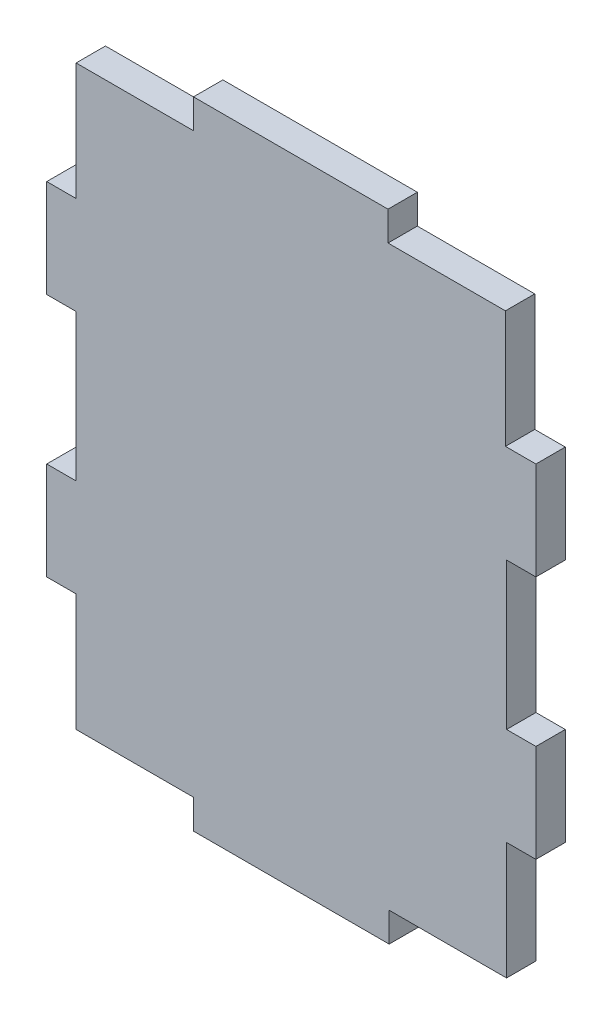
ISO-10303-21;
HEADER;
FILE_DESCRIPTION(('STEP AP214'),'2;1');
FILE_NAME('part.step','',(''),(''),'','','');
FILE_SCHEMA(('AUTOMOTIVE_DESIGN { 1 0 10303 214 1 1 1 1 }'));
ENDSEC;
DATA;
#1=APPLICATION_CONTEXT('core data for automotive mechanical design processes');
#2=APPLICATION_PROTOCOL_DEFINITION('international standard','automotive_design',2000,#1);
#3=PRODUCT_CONTEXT('',#1,'mechanical');
#4=PRODUCT('Part','Part','',(#3));
#5=PRODUCT_RELATED_PRODUCT_CATEGORY('part','',(#4));
#6=PRODUCT_DEFINITION_FORMATION('','',#4);
#7=PRODUCT_DEFINITION_CONTEXT('part definition',#1,'design');
#8=PRODUCT_DEFINITION('design','',#6,#7);
#9=PRODUCT_DEFINITION_SHAPE('','',#8);
#10=(LENGTH_UNIT() NAMED_UNIT(*) SI_UNIT(.MILLI.,.METRE.));
#11=(NAMED_UNIT(*) PLANE_ANGLE_UNIT() SI_UNIT($,.RADIAN.));
#12=(NAMED_UNIT(*) SI_UNIT($,.STERADIAN.) SOLID_ANGLE_UNIT());
#13=UNCERTAINTY_MEASURE_WITH_UNIT(LENGTH_MEASURE(1.E-05),#10,'distance_accuracy_value','');
#14=(GEOMETRIC_REPRESENTATION_CONTEXT(3) GLOBAL_UNCERTAINTY_ASSIGNED_CONTEXT((#13)) GLOBAL_UNIT_ASSIGNED_CONTEXT((#10,
#11,#12)) REPRESENTATION_CONTEXT('',''));
#15=CARTESIAN_POINT('',(0.,0.,0.));
#16=DIRECTION('',(0.,0.,1.));
#17=DIRECTION('',(1.,0.,0.));
#18=AXIS2_PLACEMENT_3D('',#15,#16,#17);
#19=CARTESIAN_POINT('',(0.,0.,6.));
#20=DIRECTION('',(-1.,0.,0.));
#21=DIRECTION('',(0.,-1.,0.));
#22=AXIS2_PLACEMENT_3D('',#19,#20,#21);
#23=PLANE('',#22);
#24=DIRECTION('',(0.,1.,0.));
#25=VECTOR('',#24,1.);
#26=CARTESIAN_POINT('',(0.,0.,0.));
#27=LINE('',#26,#25);
#28=CARTESIAN_POINT('',(0.,30.,0.));
#29=VERTEX_POINT('',#28);
#30=CARTESIAN_POINT('',(0.,50.,0.));
#31=VERTEX_POINT('',#30);
#32=EDGE_CURVE('E243',#29,#31,#27,.T.);
#33=ORIENTED_EDGE('',*,*,#32,.T.);
#34=DIRECTION('',(0.,0.,1.));
#35=VECTOR('',#34,1.);
#36=CARTESIAN_POINT('',(0.,50.,0.));
#37=LINE('',#36,#35);
#38=CARTESIAN_POINT('',(0.,50.,6.));
#39=VERTEX_POINT('',#38);
#40=EDGE_CURVE('E391',#31,#39,#37,.T.);
#41=ORIENTED_EDGE('',*,*,#40,.T.);
#42=DIRECTION('',(0.,1.,0.));
#43=VECTOR('',#42,1.);
#44=CARTESIAN_POINT('',(0.,0.,6.));
#45=LINE('',#44,#43);
#46=CARTESIAN_POINT('',(0.,30.,6.));
#47=VERTEX_POINT('',#46);
#48=EDGE_CURVE('E371',#47,#39,#45,.T.);
#49=ORIENTED_EDGE('',*,*,#48,.F.);
#50=DIRECTION('',(0.,0.,1.));
#51=VECTOR('',#50,1.);
#52=CARTESIAN_POINT('',(0.,30.,0.));
#53=LINE('',#52,#51);
#54=EDGE_CURVE('E425',#29,#47,#53,.T.);
#55=ORIENTED_EDGE('',*,*,#54,.F.);
#56=EDGE_LOOP('',(#33,#41,#49,#55));
#57=FACE_BOUND('',#56,.T.);
#58=ADVANCED_FACE('F33',(#57),#23,.F.);
#59=CARTESIAN_POINT('',(-100.,0.,6.));
#60=DIRECTION('',(1.,0.,0.));
#61=DIRECTION('',(0.,0.,-1.));
#62=AXIS2_PLACEMENT_3D('',#59,#60,#61);
#63=PLANE('',#62);
#64=DIRECTION('',(0.,-1.,0.));
#65=VECTOR('',#64,1.);
#66=CARTESIAN_POINT('',(-100.,0.,0.));
#67=LINE('',#66,#65);
#68=CARTESIAN_POINT('',(-100.,100.,0.));
#69=VERTEX_POINT('',#68);
#70=CARTESIAN_POINT('',(-100.,80.,0.));
#71=VERTEX_POINT('',#70);
#72=EDGE_CURVE('E254',#69,#71,#67,.T.);
#73=ORIENTED_EDGE('',*,*,#72,.T.);
#74=DIRECTION('',(0.,0.,1.));
#75=VECTOR('',#74,1.);
#76=CARTESIAN_POINT('',(-100.,80.,0.));
#77=LINE('',#76,#75);
#78=CARTESIAN_POINT('',(-100.,80.,6.));
#79=VERTEX_POINT('',#78);
#80=EDGE_CURVE('E404',#71,#79,#77,.T.);
#81=ORIENTED_EDGE('',*,*,#80,.T.);
#82=DIRECTION('',(0.,-1.,0.));
#83=VECTOR('',#82,1.);
#84=CARTESIAN_POINT('',(-100.,0.,6.));
#85=LINE('',#84,#83);
#86=CARTESIAN_POINT('',(-100.,100.,6.));
#87=VERTEX_POINT('',#86);
#88=EDGE_CURVE('E42',#87,#79,#85,.T.);
#89=ORIENTED_EDGE('',*,*,#88,.F.);
#90=DIRECTION('',(0.,0.,1.));
#91=VECTOR('',#90,1.);
#92=CARTESIAN_POINT('',(-100.,100.,0.));
#93=LINE('',#92,#91);
#94=EDGE_CURVE('E354',#69,#87,#93,.T.);
#95=ORIENTED_EDGE('',*,*,#94,.F.);
#96=EDGE_LOOP('',(#73,#81,#89,#95));
#97=FACE_BOUND('',#96,.T.);
#98=ADVANCED_FACE('F467',(#97),#63,.F.);
#99=CARTESIAN_POINT('',(0.,80.,6.));
#100=VERTEX_POINT('',#99);
#101=CARTESIAN_POINT('',(0.,100.,6.));
#102=VERTEX_POINT('',#101);
#103=EDGE_CURVE('E235',#100,#102,#45,.T.);
#104=ORIENTED_EDGE('',*,*,#103,.F.);
#105=DIRECTION('',(0.,0.,1.));
#106=VECTOR('',#105,1.);
#107=CARTESIAN_POINT('',(0.,80.,0.));
#108=LINE('',#107,#106);
#109=CARTESIAN_POINT('',(0.,80.,0.));
#110=VERTEX_POINT('',#109);
#111=EDGE_CURVE('E223',#110,#100,#108,.T.);
#112=ORIENTED_EDGE('',*,*,#111,.F.);
#113=CARTESIAN_POINT('',(0.,100.,0.));
#114=VERTEX_POINT('',#113);
#115=EDGE_CURVE('E233',#110,#114,#27,.T.);
#116=ORIENTED_EDGE('',*,*,#115,.T.);
#117=DIRECTION('',(0.,0.,1.));
#118=VECTOR('',#117,1.);
#119=CARTESIAN_POINT('',(0.,100.,0.));
#120=LINE('',#119,#118);
#121=EDGE_CURVE('E331',#114,#102,#120,.T.);
#122=ORIENTED_EDGE('',*,*,#121,.T.);
#123=EDGE_LOOP('',(#104,#112,#116,#122));
#124=FACE_BOUND('',#123,.T.);
#125=ADVANCED_FACE('F35',(#124),#23,.F.);
#126=CARTESIAN_POINT('',(0.,130.,6.));
#127=DIRECTION('',(0.,-1.,0.));
#128=DIRECTION('',(1.,0.,0.));
#129=AXIS2_PLACEMENT_3D('',#126,#127,#128);
#130=PLANE('',#129);
#131=DIRECTION('',(-1.,0.,0.));
#132=VECTOR('',#131,1.);
#133=CARTESIAN_POINT('',(0.,130.,6.));
#134=LINE('',#133,#132);
#135=CARTESIAN_POINT('',(-30.2354916591572,130.,6.));
#136=VERTEX_POINT('',#135);
#137=CARTESIAN_POINT('',(-70.,130.,6.));
#138=VERTEX_POINT('',#137);
#139=EDGE_CURVE('E374',#136,#138,#134,.T.);
#140=ORIENTED_EDGE('',*,*,#139,.F.);
#141=DIRECTION('',(0.,0.,1.));
#142=VECTOR('',#141,1.);
#143=CARTESIAN_POINT('',(-30.2354916591572,130.,0.));
#144=LINE('',#143,#142);
#145=CARTESIAN_POINT('',(-30.2354916591572,130.,0.));
#146=VERTEX_POINT('',#145);
#147=EDGE_CURVE('E320',#146,#136,#144,.T.);
#148=ORIENTED_EDGE('',*,*,#147,.F.);
#149=DIRECTION('',(-1.,0.,0.));
#150=VECTOR('',#149,1.);
#151=CARTESIAN_POINT('',(0.,130.,0.));
#152=LINE('',#151,#150);
#153=CARTESIAN_POINT('',(-70.,130.,0.));
#154=VERTEX_POINT('',#153);
#155=EDGE_CURVE('E247',#146,#154,#152,.T.);
#156=ORIENTED_EDGE('',*,*,#155,.T.);
#157=DIRECTION('',(0.,0.,1.));
#158=VECTOR('',#157,1.);
#159=CARTESIAN_POINT('',(-70.,130.,0.));
#160=LINE('',#159,#158);
#161=EDGE_CURVE('E244',#154,#138,#160,.T.);
#162=ORIENTED_EDGE('',*,*,#161,.T.);
#163=EDGE_LOOP('',(#140,#148,#156,#162));
#164=FACE_BOUND('',#163,.T.);
#165=ADVANCED_FACE('F474',(#164),#130,.F.);
#166=CARTESIAN_POINT('',(-100.,50.,6.));
#167=VERTEX_POINT('',#166);
#168=CARTESIAN_POINT('',(-100.,30.,6.));
#169=VERTEX_POINT('',#168);
#170=EDGE_CURVE('E375',#167,#169,#85,.T.);
#171=ORIENTED_EDGE('',*,*,#170,.F.);
#172=DIRECTION('',(0.,0.,1.));
#173=VECTOR('',#172,1.);
#174=CARTESIAN_POINT('',(-100.,50.,0.));
#175=LINE('',#174,#173);
#176=CARTESIAN_POINT('',(-100.,50.,0.));
#177=VERTEX_POINT('',#176);
#178=EDGE_CURVE('E269',#177,#167,#175,.T.);
#179=ORIENTED_EDGE('',*,*,#178,.F.);
#180=CARTESIAN_POINT('',(-100.,30.,0.));
#181=VERTEX_POINT('',#180);
#182=EDGE_CURVE('E253',#177,#181,#67,.T.);
#183=ORIENTED_EDGE('',*,*,#182,.T.);
#184=DIRECTION('',(0.,0.,1.));
#185=VECTOR('',#184,1.);
#186=CARTESIAN_POINT('',(-100.,30.,0.));
#187=LINE('',#186,#185);
#188=EDGE_CURVE('E268',#181,#169,#187,.T.);
#189=ORIENTED_EDGE('',*,*,#188,.T.);
#190=EDGE_LOOP('',(#171,#179,#183,#189));
#191=FACE_BOUND('',#190,.T.);
#192=ADVANCED_FACE('F267',(#191),#63,.F.);
#193=CARTESIAN_POINT('',(0.,0.,6.));
#194=DIRECTION('',(0.,1.,0.));
#195=DIRECTION('',(0.,0.,1.));
#196=AXIS2_PLACEMENT_3D('',#193,#194,#195);
#197=PLANE('',#196);
#198=DIRECTION('',(1.,0.,0.));
#199=VECTOR('',#198,1.);
#200=CARTESIAN_POINT('',(0.,0.,0.));
#201=LINE('',#200,#199);
#202=CARTESIAN_POINT('',(-70.,0.,0.));
#203=VERTEX_POINT('',#202);
#204=CARTESIAN_POINT('',(-30.,0.,0.));
#205=VERTEX_POINT('',#204);
#206=EDGE_CURVE('E37',#203,#205,#201,.T.);
#207=ORIENTED_EDGE('',*,*,#206,.T.);
#208=DIRECTION('',(0.,0.,1.));
#209=VECTOR('',#208,1.);
#210=CARTESIAN_POINT('',(-30.,0.,0.));
#211=LINE('',#210,#209);
#212=CARTESIAN_POINT('',(-30.,0.,6.));
#213=VERTEX_POINT('',#212);
#214=EDGE_CURVE('E298',#205,#213,#211,.T.);
#215=ORIENTED_EDGE('',*,*,#214,.T.);
#216=DIRECTION('',(1.,0.,0.));
#217=VECTOR('',#216,1.);
#218=CARTESIAN_POINT('',(0.,0.,6.));
#219=LINE('',#218,#217);
#220=CARTESIAN_POINT('',(-70.,0.,6.));
#221=VERTEX_POINT('',#220);
#222=EDGE_CURVE('E11',#221,#213,#219,.T.);
#223=ORIENTED_EDGE('',*,*,#222,.F.);
#224=DIRECTION('',(0.,0.,1.));
#225=VECTOR('',#224,1.);
#226=CARTESIAN_POINT('',(-70.,0.,0.));
#227=LINE('',#226,#225);
#228=EDGE_CURVE('E286',#203,#221,#227,.T.);
#229=ORIENTED_EDGE('',*,*,#228,.F.);
#230=EDGE_LOOP('',(#207,#215,#223,#229));
#231=FACE_BOUND('',#230,.T.);
#232=ADVANCED_FACE('F482',(#231),#197,.F.);
#233=CARTESIAN_POINT('',(0.,0.,6.));
#234=DIRECTION('',(0.,0.,1.));
#235=DIRECTION('',(1.,0.,0.));
#236=AXIS2_PLACEMENT_3D('',#233,#234,#235);
#237=PLANE('',#236);
#238=DIRECTION('',(1.,0.,0.));
#239=VECTOR('',#238,1.);
#240=CARTESIAN_POINT('',(0.,50.,6.));
#241=LINE('',#240,#239);
#242=CARTESIAN_POINT('',(-5.99999999999999,50.,6.));
#243=VERTEX_POINT('',#242);
#244=EDGE_CURVE('E228',#243,#39,#241,.T.);
#245=ORIENTED_EDGE('',*,*,#244,.F.);
#246=DIRECTION('',(0.,-1.,0.));
#247=VECTOR('',#246,1.);
#248=CARTESIAN_POINT('',(-6.,80.,6.));
#249=LINE('',#248,#247);
#250=CARTESIAN_POINT('',(-6.,80.,6.));
#251=VERTEX_POINT('',#250);
#252=EDGE_CURVE('E566',#251,#243,#249,.T.);
#253=ORIENTED_EDGE('',*,*,#252,.F.);
#254=DIRECTION('',(-1.,0.,0.));
#255=VECTOR('',#254,1.);
#256=CARTESIAN_POINT('',(0.,80.,6.));
#257=LINE('',#256,#255);
#258=EDGE_CURVE('E569',#100,#251,#257,.T.);
#259=ORIENTED_EDGE('',*,*,#258,.F.);
#260=ORIENTED_EDGE('',*,*,#103,.T.);
#261=DIRECTION('',(1.,0.,0.));
#262=VECTOR('',#261,1.);
#263=CARTESIAN_POINT('',(0.,100.,6.));
#264=LINE('',#263,#262);
#265=CARTESIAN_POINT('',(-6.23549165915718,100.,6.));
#266=VERTEX_POINT('',#265);
#267=EDGE_CURVE('E314',#266,#102,#264,.T.);
#268=ORIENTED_EDGE('',*,*,#267,.F.);
#269=DIRECTION('',(0.,-1.,0.));
#270=VECTOR('',#269,1.);
#271=CARTESIAN_POINT('',(-6.23549165915718,124.,6.));
#272=LINE('',#271,#270);
#273=CARTESIAN_POINT('',(-6.23549165915718,124.,6.));
#274=VERTEX_POINT('',#273);
#275=EDGE_CURVE('E326',#274,#266,#272,.T.);
#276=ORIENTED_EDGE('',*,*,#275,.F.);
#277=DIRECTION('',(1.,0.,0.));
#278=VECTOR('',#277,1.);
#279=CARTESIAN_POINT('',(-6.23549165915718,124.,6.));
#280=LINE('',#279,#278);
#281=CARTESIAN_POINT('',(-30.2354916591572,124.,6.));
#282=VERTEX_POINT('',#281);
#283=EDGE_CURVE('E323',#282,#274,#280,.T.);
#284=ORIENTED_EDGE('',*,*,#283,.F.);
#285=DIRECTION('',(0.,-1.,0.));
#286=VECTOR('',#285,1.);
#287=CARTESIAN_POINT('',(-30.2354916591572,130.,6.));
#288=LINE('',#287,#286);
#289=EDGE_CURVE('E280',#136,#282,#288,.T.);
#290=ORIENTED_EDGE('',*,*,#289,.F.);
#291=ORIENTED_EDGE('',*,*,#139,.T.);
#292=DIRECTION('',(0.,1.,0.));
#293=VECTOR('',#292,1.);
#294=CARTESIAN_POINT('',(-70.,130.,6.));
#295=LINE('',#294,#293);
#296=CARTESIAN_POINT('',(-70.,124.,6.));
#297=VERTEX_POINT('',#296);
#298=EDGE_CURVE('E345',#297,#138,#295,.T.);
#299=ORIENTED_EDGE('',*,*,#298,.F.);
#300=DIRECTION('',(1.,0.,0.));
#301=VECTOR('',#300,1.);
#302=CARTESIAN_POINT('',(-94.,124.,6.));
#303=LINE('',#302,#301);
#304=CARTESIAN_POINT('',(-94.,124.,6.));
#305=VERTEX_POINT('',#304);
#306=EDGE_CURVE('E360',#305,#297,#303,.T.);
#307=ORIENTED_EDGE('',*,*,#306,.F.);
#308=DIRECTION('',(0.,1.,0.));
#309=VECTOR('',#308,1.);
#310=CARTESIAN_POINT('',(-94.,124.,6.));
#311=LINE('',#310,#309);
#312=CARTESIAN_POINT('',(-94.,100.,6.));
#313=VERTEX_POINT('',#312);
#314=EDGE_CURVE('E357',#313,#305,#311,.T.);
#315=ORIENTED_EDGE('',*,*,#314,.F.);
#316=DIRECTION('',(1.,0.,0.));
#317=VECTOR('',#316,1.);
#318=CARTESIAN_POINT('',(-100.,100.,6.));
#319=LINE('',#318,#317);
#320=EDGE_CURVE('E333',#87,#313,#319,.T.);
#321=ORIENTED_EDGE('',*,*,#320,.F.);
#322=ORIENTED_EDGE('',*,*,#88,.T.);
#323=DIRECTION('',(-1.,0.,0.));
#324=VECTOR('',#323,1.);
#325=CARTESIAN_POINT('',(-100.,80.,6.));
#326=LINE('',#325,#324);
#327=CARTESIAN_POINT('',(-94.,80.,6.));
#328=VERTEX_POINT('',#327);
#329=EDGE_CURVE('E393',#328,#79,#326,.T.);
#330=ORIENTED_EDGE('',*,*,#329,.F.);
#331=DIRECTION('',(0.,1.,0.));
#332=VECTOR('',#331,1.);
#333=CARTESIAN_POINT('',(-94.,50.,6.));
#334=LINE('',#333,#332);
#335=CARTESIAN_POINT('',(-94.,50.,6.));
#336=VERTEX_POINT('',#335);
#337=EDGE_CURVE('E389',#336,#328,#334,.T.);
#338=ORIENTED_EDGE('',*,*,#337,.F.);
#339=DIRECTION('',(1.,0.,0.));
#340=VECTOR('',#339,1.);
#341=CARTESIAN_POINT('',(-100.,50.,6.));
#342=LINE('',#341,#340);
#343=EDGE_CURVE('E387',#167,#336,#342,.T.);
#344=ORIENTED_EDGE('',*,*,#343,.F.);
#345=ORIENTED_EDGE('',*,*,#170,.T.);
#346=DIRECTION('',(-1.,0.,0.));
#347=VECTOR('',#346,1.);
#348=CARTESIAN_POINT('',(-100.,30.,6.));
#349=LINE('',#348,#347);
#350=CARTESIAN_POINT('',(-94.,30.,6.));
#351=VERTEX_POINT('',#350);
#352=EDGE_CURVE('E279',#351,#169,#349,.T.);
#353=ORIENTED_EDGE('',*,*,#352,.F.);
#354=DIRECTION('',(0.,1.,0.));
#355=VECTOR('',#354,1.);
#356=CARTESIAN_POINT('',(-94.,6.,6.));
#357=LINE('',#356,#355);
#358=CARTESIAN_POINT('',(-94.,6.,6.));
#359=VERTEX_POINT('',#358);
#360=EDGE_CURVE('E301',#359,#351,#357,.T.);
#361=ORIENTED_EDGE('',*,*,#360,.F.);
#362=DIRECTION('',(-1.,0.,0.));
#363=VECTOR('',#362,1.);
#364=CARTESIAN_POINT('',(-94.,6.,6.));
#365=LINE('',#364,#363);
#366=CARTESIAN_POINT('',(-70.,6.,6.));
#367=VERTEX_POINT('',#366);
#368=EDGE_CURVE('E297',#367,#359,#365,.T.);
#369=ORIENTED_EDGE('',*,*,#368,.F.);
#370=DIRECTION('',(0.,1.,0.));
#371=VECTOR('',#370,1.);
#372=CARTESIAN_POINT('',(-70.,0.,6.));
#373=LINE('',#372,#371);
#374=EDGE_CURVE('E294',#221,#367,#373,.T.);
#375=ORIENTED_EDGE('',*,*,#374,.F.);
#376=ORIENTED_EDGE('',*,*,#222,.T.);
#377=DIRECTION('',(0.,-1.,0.));
#378=VECTOR('',#377,1.);
#379=CARTESIAN_POINT('',(-30.,0.,6.));
#380=LINE('',#379,#378);
#381=CARTESIAN_POINT('',(-30.,5.99999999999999,6.));
#382=VERTEX_POINT('',#381);
#383=EDGE_CURVE('E416',#382,#213,#380,.T.);
#384=ORIENTED_EDGE('',*,*,#383,.F.);
#385=DIRECTION('',(-1.,0.,0.));
#386=VECTOR('',#385,1.);
#387=CARTESIAN_POINT('',(-6.,6.,6.));
#388=LINE('',#387,#386);
#389=CARTESIAN_POINT('',(-6.,6.,6.));
#390=VERTEX_POINT('',#389);
#391=EDGE_CURVE('E431',#390,#382,#388,.T.);
#392=ORIENTED_EDGE('',*,*,#391,.F.);
#393=DIRECTION('',(0.,-1.,0.));
#394=VECTOR('',#393,1.);
#395=CARTESIAN_POINT('',(-6.,6.,6.));
#396=LINE('',#395,#394);
#397=CARTESIAN_POINT('',(-6.,30.,6.));
#398=VERTEX_POINT('',#397);
#399=EDGE_CURVE('E428',#398,#390,#396,.T.);
#400=ORIENTED_EDGE('',*,*,#399,.F.);
#401=DIRECTION('',(-1.,0.,0.));
#402=VECTOR('',#401,1.);
#403=CARTESIAN_POINT('',(0.,30.,6.));
#404=LINE('',#403,#402);
#405=EDGE_CURVE('E406',#47,#398,#404,.T.);
#406=ORIENTED_EDGE('',*,*,#405,.F.);
#407=ORIENTED_EDGE('',*,*,#48,.T.);
#408=EDGE_LOOP('',(#245,#253,#259,#260,#268,#276,#284,#290,#291,#299,#307,#315,#321,#322,#330,
#338,#344,#345,#353,#361,#369,#375,#376,#384,#392,#400,#406,#407));
#409=FACE_BOUND('',#408,.T.);
#410=ADVANCED_FACE('F383',(#409),#237,.T.);
#411=CARTESIAN_POINT('',(0.,0.,0.));
#412=DIRECTION('',(0.,0.,1.));
#413=DIRECTION('',(1.,0.,0.));
#414=AXIS2_PLACEMENT_3D('',#411,#412,#413);
#415=PLANE('',#414);
#416=DIRECTION('',(0.,-1.,0.));
#417=VECTOR('',#416,1.);
#418=CARTESIAN_POINT('',(-6.,80.,0.));
#419=LINE('',#418,#417);
#420=CARTESIAN_POINT('',(-6.,80.,0.));
#421=VERTEX_POINT('',#420);
#422=CARTESIAN_POINT('',(-5.99999999999999,50.,0.));
#423=VERTEX_POINT('',#422);
#424=EDGE_CURVE('E50',#421,#423,#419,.T.);
#425=ORIENTED_EDGE('',*,*,#424,.T.);
#426=DIRECTION('',(1.,0.,0.));
#427=VECTOR('',#426,1.);
#428=CARTESIAN_POINT('',(0.,50.,0.));
#429=LINE('',#428,#427);
#430=EDGE_CURVE('E236',#423,#31,#429,.T.);
#431=ORIENTED_EDGE('',*,*,#430,.T.);
#432=ORIENTED_EDGE('',*,*,#32,.F.);
#433=DIRECTION('',(-1.,0.,0.));
#434=VECTOR('',#433,1.);
#435=CARTESIAN_POINT('',(0.,30.,0.));
#436=LINE('',#435,#434);
#437=CARTESIAN_POINT('',(-6.,30.,0.));
#438=VERTEX_POINT('',#437);
#439=EDGE_CURVE('E412',#29,#438,#436,.T.);
#440=ORIENTED_EDGE('',*,*,#439,.T.);
#441=DIRECTION('',(0.,-1.,0.));
#442=VECTOR('',#441,1.);
#443=CARTESIAN_POINT('',(-6.,6.,0.));
#444=LINE('',#443,#442);
#445=CARTESIAN_POINT('',(-6.,6.,0.));
#446=VERTEX_POINT('',#445);
#447=EDGE_CURVE('E415',#438,#446,#444,.T.);
#448=ORIENTED_EDGE('',*,*,#447,.T.);
#449=DIRECTION('',(-1.,0.,0.));
#450=VECTOR('',#449,1.);
#451=CARTESIAN_POINT('',(-6.,6.,0.));
#452=LINE('',#451,#450);
#453=CARTESIAN_POINT('',(-30.,5.99999999999999,0.));
#454=VERTEX_POINT('',#453);
#455=EDGE_CURVE('E419',#446,#454,#452,.T.);
#456=ORIENTED_EDGE('',*,*,#455,.T.);
#457=DIRECTION('',(0.,-1.,0.));
#458=VECTOR('',#457,1.);
#459=CARTESIAN_POINT('',(-30.,0.,0.));
#460=LINE('',#459,#458);
#461=EDGE_CURVE('E422',#454,#205,#460,.T.);
#462=ORIENTED_EDGE('',*,*,#461,.T.);
#463=ORIENTED_EDGE('',*,*,#206,.F.);
#464=DIRECTION('',(0.,1.,0.));
#465=VECTOR('',#464,1.);
#466=CARTESIAN_POINT('',(-70.,0.,0.));
#467=LINE('',#466,#465);
#468=CARTESIAN_POINT('',(-70.,6.,0.));
#469=VERTEX_POINT('',#468);
#470=EDGE_CURVE('E304',#203,#469,#467,.T.);
#471=ORIENTED_EDGE('',*,*,#470,.T.);
#472=DIRECTION('',(-1.,0.,0.));
#473=VECTOR('',#472,1.);
#474=CARTESIAN_POINT('',(-94.,6.,0.));
#475=LINE('',#474,#473);
#476=CARTESIAN_POINT('',(-94.,6.,0.));
#477=VERTEX_POINT('',#476);
#478=EDGE_CURVE('E290',#469,#477,#475,.T.);
#479=ORIENTED_EDGE('',*,*,#478,.T.);
#480=DIRECTION('',(0.,1.,0.));
#481=VECTOR('',#480,1.);
#482=CARTESIAN_POINT('',(-94.,6.,0.));
#483=LINE('',#482,#481);
#484=CARTESIAN_POINT('',(-94.,30.,0.));
#485=VERTEX_POINT('',#484);
#486=EDGE_CURVE('E285',#477,#485,#483,.T.);
#487=ORIENTED_EDGE('',*,*,#486,.T.);
#488=DIRECTION('',(-1.,0.,0.));
#489=VECTOR('',#488,1.);
#490=CARTESIAN_POINT('',(-100.,30.,0.));
#491=LINE('',#490,#489);
#492=EDGE_CURVE('E276',#485,#181,#491,.T.);
#493=ORIENTED_EDGE('',*,*,#492,.T.);
#494=ORIENTED_EDGE('',*,*,#182,.F.);
#495=DIRECTION('',(1.,0.,0.));
#496=VECTOR('',#495,1.);
#497=CARTESIAN_POINT('',(-100.,50.,0.));
#498=LINE('',#497,#496);
#499=CARTESIAN_POINT('',(-94.,50.,0.));
#500=VERTEX_POINT('',#499);
#501=EDGE_CURVE('E403',#177,#500,#498,.T.);
#502=ORIENTED_EDGE('',*,*,#501,.T.);
#503=DIRECTION('',(0.,1.,0.));
#504=VECTOR('',#503,1.);
#505=CARTESIAN_POINT('',(-94.,50.,0.));
#506=LINE('',#505,#504);
#507=CARTESIAN_POINT('',(-94.,80.,0.));
#508=VERTEX_POINT('',#507);
#509=EDGE_CURVE('E58',#500,#508,#506,.T.);
#510=ORIENTED_EDGE('',*,*,#509,.T.);
#511=DIRECTION('',(-1.,0.,0.));
#512=VECTOR('',#511,1.);
#513=CARTESIAN_POINT('',(-100.,80.,0.));
#514=LINE('',#513,#512);
#515=EDGE_CURVE('E399',#508,#71,#514,.T.);
#516=ORIENTED_EDGE('',*,*,#515,.T.);
#517=ORIENTED_EDGE('',*,*,#72,.F.);
#518=DIRECTION('',(1.,0.,0.));
#519=VECTOR('',#518,1.);
#520=CARTESIAN_POINT('',(-100.,100.,0.));
#521=LINE('',#520,#519);
#522=CARTESIAN_POINT('',(-94.,100.,0.));
#523=VERTEX_POINT('',#522);
#524=EDGE_CURVE('E341',#69,#523,#521,.T.);
#525=ORIENTED_EDGE('',*,*,#524,.T.);
#526=DIRECTION('',(0.,1.,0.));
#527=VECTOR('',#526,1.);
#528=CARTESIAN_POINT('',(-94.,124.,0.));
#529=LINE('',#528,#527);
#530=CARTESIAN_POINT('',(-94.,124.,0.));
#531=VERTEX_POINT('',#530);
#532=EDGE_CURVE('E344',#523,#531,#529,.T.);
#533=ORIENTED_EDGE('',*,*,#532,.T.);
#534=DIRECTION('',(1.,0.,0.));
#535=VECTOR('',#534,1.);
#536=CARTESIAN_POINT('',(-94.,124.,0.));
#537=LINE('',#536,#535);
#538=CARTESIAN_POINT('',(-70.,124.,0.));
#539=VERTEX_POINT('',#538);
#540=EDGE_CURVE('E348',#531,#539,#537,.T.);
#541=ORIENTED_EDGE('',*,*,#540,.T.);
#542=DIRECTION('',(0.,1.,0.));
#543=VECTOR('',#542,1.);
#544=CARTESIAN_POINT('',(-70.,130.,0.));
#545=LINE('',#544,#543);
#546=EDGE_CURVE('E351',#539,#154,#545,.T.);
#547=ORIENTED_EDGE('',*,*,#546,.T.);
#548=ORIENTED_EDGE('',*,*,#155,.F.);
#549=DIRECTION('',(0.,-1.,0.));
#550=VECTOR('',#549,1.);
#551=CARTESIAN_POINT('',(-30.2354916591572,130.,0.));
#552=LINE('',#551,#550);
#553=CARTESIAN_POINT('',(-30.2354916591572,124.,0.));
#554=VERTEX_POINT('',#553);
#555=EDGE_CURVE('E310',#146,#554,#552,.T.);
#556=ORIENTED_EDGE('',*,*,#555,.T.);
#557=DIRECTION('',(1.,0.,0.));
#558=VECTOR('',#557,1.);
#559=CARTESIAN_POINT('',(-6.23549165915718,124.,0.));
#560=LINE('',#559,#558);
#561=CARTESIAN_POINT('',(-6.23549165915718,124.,0.));
#562=VERTEX_POINT('',#561);
#563=EDGE_CURVE('E313',#554,#562,#560,.T.);
#564=ORIENTED_EDGE('',*,*,#563,.T.);
#565=DIRECTION('',(0.,-1.,0.));
#566=VECTOR('',#565,1.);
#567=CARTESIAN_POINT('',(-6.23549165915718,124.,0.));
#568=LINE('',#567,#566);
#569=CARTESIAN_POINT('',(-6.23549165915718,100.,0.));
#570=VERTEX_POINT('',#569);
#571=EDGE_CURVE('E317',#562,#570,#568,.T.);
#572=ORIENTED_EDGE('',*,*,#571,.T.);
#573=DIRECTION('',(1.,0.,0.));
#574=VECTOR('',#573,1.);
#575=CARTESIAN_POINT('',(0.,100.,0.));
#576=LINE('',#575,#574);
#577=EDGE_CURVE('E242',#570,#114,#576,.T.);
#578=ORIENTED_EDGE('',*,*,#577,.T.);
#579=ORIENTED_EDGE('',*,*,#115,.F.);
#580=DIRECTION('',(-1.,0.,0.));
#581=VECTOR('',#580,1.);
#582=CARTESIAN_POINT('',(0.,80.,0.));
#583=LINE('',#582,#581);
#584=EDGE_CURVE('E219',#110,#421,#583,.T.);
#585=ORIENTED_EDGE('',*,*,#584,.T.);
#586=EDGE_LOOP('',(#425,#431,#432,#440,#448,#456,#462,#463,#471,#479,#487,#493,#494,#502,#510,
#516,#517,#525,#533,#541,#547,#548,#556,#564,#572,#578,#579,#585));
#587=FACE_BOUND('',#586,.T.);
#588=ADVANCED_FACE('F239',(#587),#415,.F.);
#589=CARTESIAN_POINT('',(-70.,130.,0.));
#590=DIRECTION('',(1.,0.,0.));
#591=DIRECTION('',(0.,1.,0.));
#592=AXIS2_PLACEMENT_3D('',#589,#590,#591);
#593=PLANE('',#592);
#594=ORIENTED_EDGE('',*,*,#298,.T.);
#595=ORIENTED_EDGE('',*,*,#161,.F.);
#596=ORIENTED_EDGE('',*,*,#546,.F.);
#597=DIRECTION('',(0.,0.,1.));
#598=VECTOR('',#597,1.);
#599=CARTESIAN_POINT('',(-70.,124.,0.));
#600=LINE('',#599,#598);
#601=EDGE_CURVE('E249',#539,#297,#600,.T.);
#602=ORIENTED_EDGE('',*,*,#601,.T.);
#603=EDGE_LOOP('',(#594,#595,#596,#602));
#604=FACE_BOUND('',#603,.T.);
#605=ADVANCED_FACE('F490',(#604),#593,.F.);
#606=CARTESIAN_POINT('',(-94.,124.,0.));
#607=DIRECTION('',(0.,-1.,0.));
#608=DIRECTION('',(0.,0.,-1.));
#609=AXIS2_PLACEMENT_3D('',#606,#607,#608);
#610=PLANE('',#609);
#611=ORIENTED_EDGE('',*,*,#306,.T.);
#612=ORIENTED_EDGE('',*,*,#601,.F.);
#613=ORIENTED_EDGE('',*,*,#540,.F.);
#614=DIRECTION('',(0.,0.,1.));
#615=VECTOR('',#614,1.);
#616=CARTESIAN_POINT('',(-94.,124.,0.));
#617=LINE('',#616,#615);
#618=EDGE_CURVE('E366',#531,#305,#617,.T.);
#619=ORIENTED_EDGE('',*,*,#618,.T.);
#620=EDGE_LOOP('',(#611,#612,#613,#619));
#621=FACE_BOUND('',#620,.T.);
#622=ADVANCED_FACE('F501',(#621),#610,.F.);
#623=CARTESIAN_POINT('',(-94.,124.,0.));
#624=DIRECTION('',(1.,0.,0.));
#625=DIRECTION('',(0.,0.,-1.));
#626=AXIS2_PLACEMENT_3D('',#623,#624,#625);
#627=PLANE('',#626);
#628=ORIENTED_EDGE('',*,*,#314,.T.);
#629=ORIENTED_EDGE('',*,*,#618,.F.);
#630=ORIENTED_EDGE('',*,*,#532,.F.);
#631=DIRECTION('',(0.,0.,1.));
#632=VECTOR('',#631,1.);
#633=CARTESIAN_POINT('',(-94.,100.,0.));
#634=LINE('',#633,#632);
#635=EDGE_CURVE('E368',#523,#313,#634,.T.);
#636=ORIENTED_EDGE('',*,*,#635,.T.);
#637=EDGE_LOOP('',(#628,#629,#630,#636));
#638=FACE_BOUND('',#637,.T.);
#639=ADVANCED_FACE('F497',(#638),#627,.F.);
#640=CARTESIAN_POINT('',(-100.,100.,0.));
#641=DIRECTION('',(0.,-1.,0.));
#642=DIRECTION('',(1.,0.,0.));
#643=AXIS2_PLACEMENT_3D('',#640,#641,#642);
#644=PLANE('',#643);
#645=ORIENTED_EDGE('',*,*,#320,.T.);
#646=ORIENTED_EDGE('',*,*,#635,.F.);
#647=ORIENTED_EDGE('',*,*,#524,.F.);
#648=ORIENTED_EDGE('',*,*,#94,.T.);
#649=EDGE_LOOP('',(#645,#646,#647,#648));
#650=FACE_BOUND('',#649,.T.);
#651=ADVANCED_FACE('F493',(#650),#644,.F.);
#652=CARTESIAN_POINT('',(0.,100.,0.));
#653=DIRECTION('',(0.,-1.,0.));
#654=DIRECTION('',(0.,0.,-1.));
#655=AXIS2_PLACEMENT_3D('',#652,#653,#654);
#656=PLANE('',#655);
#657=ORIENTED_EDGE('',*,*,#267,.T.);
#658=ORIENTED_EDGE('',*,*,#121,.F.);
#659=ORIENTED_EDGE('',*,*,#577,.F.);
#660=DIRECTION('',(0.,0.,1.));
#661=VECTOR('',#660,1.);
#662=CARTESIAN_POINT('',(-6.23549165915718,100.,0.));
#663=LINE('',#662,#661);
#664=EDGE_CURVE('E334',#570,#266,#663,.T.);
#665=ORIENTED_EDGE('',*,*,#664,.T.);
#666=EDGE_LOOP('',(#657,#658,#659,#665));
#667=FACE_BOUND('',#666,.T.);
#668=ADVANCED_FACE('F496',(#667),#656,.F.);
#669=CARTESIAN_POINT('',(-6.23549165915718,124.,0.));
#670=DIRECTION('',(-1.,0.,0.));
#671=DIRECTION('',(0.,-1.,0.));
#672=AXIS2_PLACEMENT_3D('',#669,#670,#671);
#673=PLANE('',#672);
#674=ORIENTED_EDGE('',*,*,#275,.T.);
#675=ORIENTED_EDGE('',*,*,#664,.F.);
#676=ORIENTED_EDGE('',*,*,#571,.F.);
#677=DIRECTION('',(0.,0.,1.));
#678=VECTOR('',#677,1.);
#679=CARTESIAN_POINT('',(-6.23549165915718,124.,0.));
#680=LINE('',#679,#678);
#681=EDGE_CURVE('E336',#562,#274,#680,.T.);
#682=ORIENTED_EDGE('',*,*,#681,.T.);
#683=EDGE_LOOP('',(#674,#675,#676,#682));
#684=FACE_BOUND('',#683,.T.);
#685=ADVANCED_FACE('F515',(#684),#673,.F.);
#686=CARTESIAN_POINT('',(-6.23549165915718,124.,0.));
#687=DIRECTION('',(0.,-1.,0.));
#688=DIRECTION('',(0.,0.,-1.));
#689=AXIS2_PLACEMENT_3D('',#686,#687,#688);
#690=PLANE('',#689);
#691=ORIENTED_EDGE('',*,*,#283,.T.);
#692=ORIENTED_EDGE('',*,*,#681,.F.);
#693=ORIENTED_EDGE('',*,*,#563,.F.);
#694=DIRECTION('',(0.,0.,1.));
#695=VECTOR('',#694,1.);
#696=CARTESIAN_POINT('',(-30.2354916591572,124.,0.));
#697=LINE('',#696,#695);
#698=EDGE_CURVE('E338',#554,#282,#697,.T.);
#699=ORIENTED_EDGE('',*,*,#698,.T.);
#700=EDGE_LOOP('',(#691,#692,#693,#699));
#701=FACE_BOUND('',#700,.T.);
#702=ADVANCED_FACE('F511',(#701),#690,.F.);
#703=CARTESIAN_POINT('',(-30.2354916591572,130.,0.));
#704=DIRECTION('',(-1.,0.,0.));
#705=DIRECTION('',(0.,0.,1.));
#706=AXIS2_PLACEMENT_3D('',#703,#704,#705);
#707=PLANE('',#706);
#708=ORIENTED_EDGE('',*,*,#289,.T.);
#709=ORIENTED_EDGE('',*,*,#698,.F.);
#710=ORIENTED_EDGE('',*,*,#555,.F.);
#711=ORIENTED_EDGE('',*,*,#147,.T.);
#712=EDGE_LOOP('',(#708,#709,#710,#711));
#713=FACE_BOUND('',#712,.T.);
#714=ADVANCED_FACE('F464',(#713),#707,.F.);
#715=CARTESIAN_POINT('',(-100.,30.,0.));
#716=DIRECTION('',(0.,1.,0.));
#717=DIRECTION('',(0.,0.,1.));
#718=AXIS2_PLACEMENT_3D('',#715,#716,#717);
#719=PLANE('',#718);
#720=ORIENTED_EDGE('',*,*,#352,.T.);
#721=ORIENTED_EDGE('',*,*,#188,.F.);
#722=ORIENTED_EDGE('',*,*,#492,.F.);
#723=DIRECTION('',(0.,0.,1.));
#724=VECTOR('',#723,1.);
#725=CARTESIAN_POINT('',(-94.,30.,0.));
#726=LINE('',#725,#724);
#727=EDGE_CURVE('E281',#485,#351,#726,.T.);
#728=ORIENTED_EDGE('',*,*,#727,.T.);
#729=EDGE_LOOP('',(#720,#721,#722,#728));
#730=FACE_BOUND('',#729,.T.);
#731=ADVANCED_FACE('F275',(#730),#719,.F.);
#732=CARTESIAN_POINT('',(-94.,6.,0.));
#733=DIRECTION('',(1.,0.,0.));
#734=DIRECTION('',(0.,0.,-1.));
#735=AXIS2_PLACEMENT_3D('',#732,#733,#734);
#736=PLANE('',#735);
#737=ORIENTED_EDGE('',*,*,#360,.T.);
#738=ORIENTED_EDGE('',*,*,#727,.F.);
#739=ORIENTED_EDGE('',*,*,#486,.F.);
#740=DIRECTION('',(0.,0.,1.));
#741=VECTOR('',#740,1.);
#742=CARTESIAN_POINT('',(-94.,6.,0.));
#743=LINE('',#742,#741);
#744=EDGE_CURVE('E307',#477,#359,#743,.T.);
#745=ORIENTED_EDGE('',*,*,#744,.T.);
#746=EDGE_LOOP('',(#737,#738,#739,#745));
#747=FACE_BOUND('',#746,.T.);
#748=ADVANCED_FACE('F456',(#747),#736,.F.);
#749=CARTESIAN_POINT('',(-94.,6.,0.));
#750=DIRECTION('',(0.,1.,0.));
#751=DIRECTION('',(0.,0.,1.));
#752=AXIS2_PLACEMENT_3D('',#749,#750,#751);
#753=PLANE('',#752);
#754=ORIENTED_EDGE('',*,*,#368,.T.);
#755=ORIENTED_EDGE('',*,*,#744,.F.);
#756=ORIENTED_EDGE('',*,*,#478,.F.);
#757=DIRECTION('',(0.,0.,1.));
#758=VECTOR('',#757,1.);
#759=CARTESIAN_POINT('',(-70.,6.,0.));
#760=LINE('',#759,#758);
#761=EDGE_CURVE('E288',#469,#367,#760,.T.);
#762=ORIENTED_EDGE('',*,*,#761,.T.);
#763=EDGE_LOOP('',(#754,#755,#756,#762));
#764=FACE_BOUND('',#763,.T.);
#765=ADVANCED_FACE('F448',(#764),#753,.F.);
#766=CARTESIAN_POINT('',(-70.,0.,0.));
#767=DIRECTION('',(1.,0.,0.));
#768=DIRECTION('',(0.,0.,-1.));
#769=AXIS2_PLACEMENT_3D('',#766,#767,#768);
#770=PLANE('',#769);
#771=ORIENTED_EDGE('',*,*,#374,.T.);
#772=ORIENTED_EDGE('',*,*,#761,.F.);
#773=ORIENTED_EDGE('',*,*,#470,.F.);
#774=ORIENTED_EDGE('',*,*,#228,.T.);
#775=EDGE_LOOP('',(#771,#772,#773,#774));
#776=FACE_BOUND('',#775,.T.);
#777=ADVANCED_FACE('F450',(#776),#770,.F.);
#778=CARTESIAN_POINT('',(-30.,0.,0.));
#779=DIRECTION('',(-1.,0.,0.));
#780=DIRECTION('',(0.,0.,1.));
#781=AXIS2_PLACEMENT_3D('',#778,#779,#780);
#782=PLANE('',#781);
#783=ORIENTED_EDGE('',*,*,#383,.T.);
#784=ORIENTED_EDGE('',*,*,#214,.F.);
#785=ORIENTED_EDGE('',*,*,#461,.F.);
#786=DIRECTION('',(0.,0.,1.));
#787=VECTOR('',#786,1.);
#788=CARTESIAN_POINT('',(-30.,5.99999999999999,0.));
#789=LINE('',#788,#787);
#790=EDGE_CURVE('E437',#454,#382,#789,.T.);
#791=ORIENTED_EDGE('',*,*,#790,.T.);
#792=EDGE_LOOP('',(#783,#784,#785,#791));
#793=FACE_BOUND('',#792,.T.);
#794=ADVANCED_FACE('F524',(#793),#782,.F.);
#795=CARTESIAN_POINT('',(-6.,6.,0.));
#796=DIRECTION('',(0.,1.,0.));
#797=DIRECTION('',(-1.,0.,0.));
#798=AXIS2_PLACEMENT_3D('',#795,#796,#797);
#799=PLANE('',#798);
#800=ORIENTED_EDGE('',*,*,#391,.T.);
#801=ORIENTED_EDGE('',*,*,#790,.F.);
#802=ORIENTED_EDGE('',*,*,#455,.F.);
#803=DIRECTION('',(0.,0.,1.));
#804=VECTOR('',#803,1.);
#805=CARTESIAN_POINT('',(-6.,6.,0.));
#806=LINE('',#805,#804);
#807=EDGE_CURVE('E439',#446,#390,#806,.T.);
#808=ORIENTED_EDGE('',*,*,#807,.T.);
#809=EDGE_LOOP('',(#800,#801,#802,#808));
#810=FACE_BOUND('',#809,.T.);
#811=ADVANCED_FACE('F528',(#810),#799,.F.);
#812=CARTESIAN_POINT('',(-6.,6.,0.));
#813=DIRECTION('',(-1.,0.,0.));
#814=DIRECTION('',(0.,0.,1.));
#815=AXIS2_PLACEMENT_3D('',#812,#813,#814);
#816=PLANE('',#815);
#817=ORIENTED_EDGE('',*,*,#399,.T.);
#818=ORIENTED_EDGE('',*,*,#807,.F.);
#819=ORIENTED_EDGE('',*,*,#447,.F.);
#820=DIRECTION('',(0.,0.,1.));
#821=VECTOR('',#820,1.);
#822=CARTESIAN_POINT('',(-6.,30.,0.));
#823=LINE('',#822,#821);
#824=EDGE_CURVE('E441',#438,#398,#823,.T.);
#825=ORIENTED_EDGE('',*,*,#824,.T.);
#826=EDGE_LOOP('',(#817,#818,#819,#825));
#827=FACE_BOUND('',#826,.T.);
#828=ADVANCED_FACE('F534',(#827),#816,.F.);
#829=CARTESIAN_POINT('',(0.,30.,0.));
#830=DIRECTION('',(0.,1.,0.));
#831=DIRECTION('',(0.,0.,1.));
#832=AXIS2_PLACEMENT_3D('',#829,#830,#831);
#833=PLANE('',#832);
#834=ORIENTED_EDGE('',*,*,#405,.T.);
#835=ORIENTED_EDGE('',*,*,#824,.F.);
#836=ORIENTED_EDGE('',*,*,#439,.F.);
#837=ORIENTED_EDGE('',*,*,#54,.T.);
#838=EDGE_LOOP('',(#834,#835,#836,#837));
#839=FACE_BOUND('',#838,.T.);
#840=ADVANCED_FACE('F543',(#839),#833,.F.);
#841=CARTESIAN_POINT('',(-100.,80.,0.));
#842=DIRECTION('',(0.,1.,0.));
#843=DIRECTION('',(0.,0.,1.));
#844=AXIS2_PLACEMENT_3D('',#841,#842,#843);
#845=PLANE('',#844);
#846=ORIENTED_EDGE('',*,*,#329,.T.);
#847=ORIENTED_EDGE('',*,*,#80,.F.);
#848=ORIENTED_EDGE('',*,*,#515,.F.);
#849=DIRECTION('',(0.,0.,1.));
#850=VECTOR('',#849,1.);
#851=CARTESIAN_POINT('',(-94.,80.,0.));
#852=LINE('',#851,#850);
#853=EDGE_CURVE('E407',#508,#328,#852,.T.);
#854=ORIENTED_EDGE('',*,*,#853,.T.);
#855=EDGE_LOOP('',(#846,#847,#848,#854));
#856=FACE_BOUND('',#855,.T.);
#857=ADVANCED_FACE('F546',(#856),#845,.F.);
#858=CARTESIAN_POINT('',(-94.,50.,0.));
#859=DIRECTION('',(1.,0.,0.));
#860=DIRECTION('',(0.,0.,-1.));
#861=AXIS2_PLACEMENT_3D('',#858,#859,#860);
#862=PLANE('',#861);
#863=ORIENTED_EDGE('',*,*,#337,.T.);
#864=ORIENTED_EDGE('',*,*,#853,.F.);
#865=ORIENTED_EDGE('',*,*,#509,.F.);
#866=DIRECTION('',(0.,0.,1.));
#867=VECTOR('',#866,1.);
#868=CARTESIAN_POINT('',(-94.,50.,0.));
#869=LINE('',#868,#867);
#870=EDGE_CURVE('E409',#500,#336,#869,.T.);
#871=ORIENTED_EDGE('',*,*,#870,.T.);
#872=EDGE_LOOP('',(#863,#864,#865,#871));
#873=FACE_BOUND('',#872,.T.);
#874=ADVANCED_FACE('F551',(#873),#862,.F.);
#875=CARTESIAN_POINT('',(-100.,50.,0.));
#876=DIRECTION('',(0.,-1.,0.));
#877=DIRECTION('',(0.,0.,-1.));
#878=AXIS2_PLACEMENT_3D('',#875,#876,#877);
#879=PLANE('',#878);
#880=ORIENTED_EDGE('',*,*,#343,.T.);
#881=ORIENTED_EDGE('',*,*,#870,.F.);
#882=ORIENTED_EDGE('',*,*,#501,.F.);
#883=ORIENTED_EDGE('',*,*,#178,.T.);
#884=EDGE_LOOP('',(#880,#881,#882,#883));
#885=FACE_BOUND('',#884,.T.);
#886=ADVANCED_FACE('F538',(#885),#879,.F.);
#887=CARTESIAN_POINT('',(0.,50.,0.));
#888=DIRECTION('',(0.,-1.,0.));
#889=DIRECTION('',(0.,0.,-1.));
#890=AXIS2_PLACEMENT_3D('',#887,#888,#889);
#891=PLANE('',#890);
#892=ORIENTED_EDGE('',*,*,#244,.T.);
#893=ORIENTED_EDGE('',*,*,#40,.F.);
#894=ORIENTED_EDGE('',*,*,#430,.F.);
#895=DIRECTION('',(0.,0.,1.));
#896=VECTOR('',#895,1.);
#897=CARTESIAN_POINT('',(-5.99999999999999,50.,0.));
#898=LINE('',#897,#896);
#899=EDGE_CURVE('E396',#423,#243,#898,.T.);
#900=ORIENTED_EDGE('',*,*,#899,.T.);
#901=EDGE_LOOP('',(#892,#893,#894,#900));
#902=FACE_BOUND('',#901,.T.);
#903=ADVANCED_FACE('F595',(#902),#891,.F.);
#904=CARTESIAN_POINT('',(-6.,80.,0.));
#905=DIRECTION('',(-1.,0.,0.));
#906=DIRECTION('',(0.,-1.,0.));
#907=AXIS2_PLACEMENT_3D('',#904,#905,#906);
#908=PLANE('',#907);
#909=ORIENTED_EDGE('',*,*,#252,.T.);
#910=ORIENTED_EDGE('',*,*,#899,.F.);
#911=ORIENTED_EDGE('',*,*,#424,.F.);
#912=DIRECTION('',(0.,0.,1.));
#913=VECTOR('',#912,1.);
#914=CARTESIAN_POINT('',(-6.,80.,0.));
#915=LINE('',#914,#913);
#916=EDGE_CURVE('E225',#421,#251,#915,.T.);
#917=ORIENTED_EDGE('',*,*,#916,.T.);
#918=EDGE_LOOP('',(#909,#910,#911,#917));
#919=FACE_BOUND('',#918,.T.);
#920=ADVANCED_FACE('F596',(#919),#908,.F.);
#921=CARTESIAN_POINT('',(0.,80.,0.));
#922=DIRECTION('',(0.,1.,0.));
#923=DIRECTION('',(0.,0.,1.));
#924=AXIS2_PLACEMENT_3D('',#921,#922,#923);
#925=PLANE('',#924);
#926=ORIENTED_EDGE('',*,*,#258,.T.);
#927=ORIENTED_EDGE('',*,*,#916,.F.);
#928=ORIENTED_EDGE('',*,*,#584,.F.);
#929=ORIENTED_EDGE('',*,*,#111,.T.);
#930=EDGE_LOOP('',(#926,#927,#928,#929));
#931=FACE_BOUND('',#930,.T.);
#932=ADVANCED_FACE('F222',(#931),#925,.F.);
#933=CLOSED_SHELL('',(#58,#98,#125,#165,#192,#232,#410,#588,#605,#622,#639,#651,#668,#685,#702,
#714,#731,#748,#765,#777,#794,#811,#828,#840,#857,#874,#886,#903,#920,#932));
#934=MANIFOLD_SOLID_BREP('B2',#933);
#935=ADVANCED_BREP_SHAPE_REPRESENTATION('',(#18,#934),#14);
#936=SHAPE_DEFINITION_REPRESENTATION(#9,#935);
ENDSEC;
END-ISO-10303-21;
